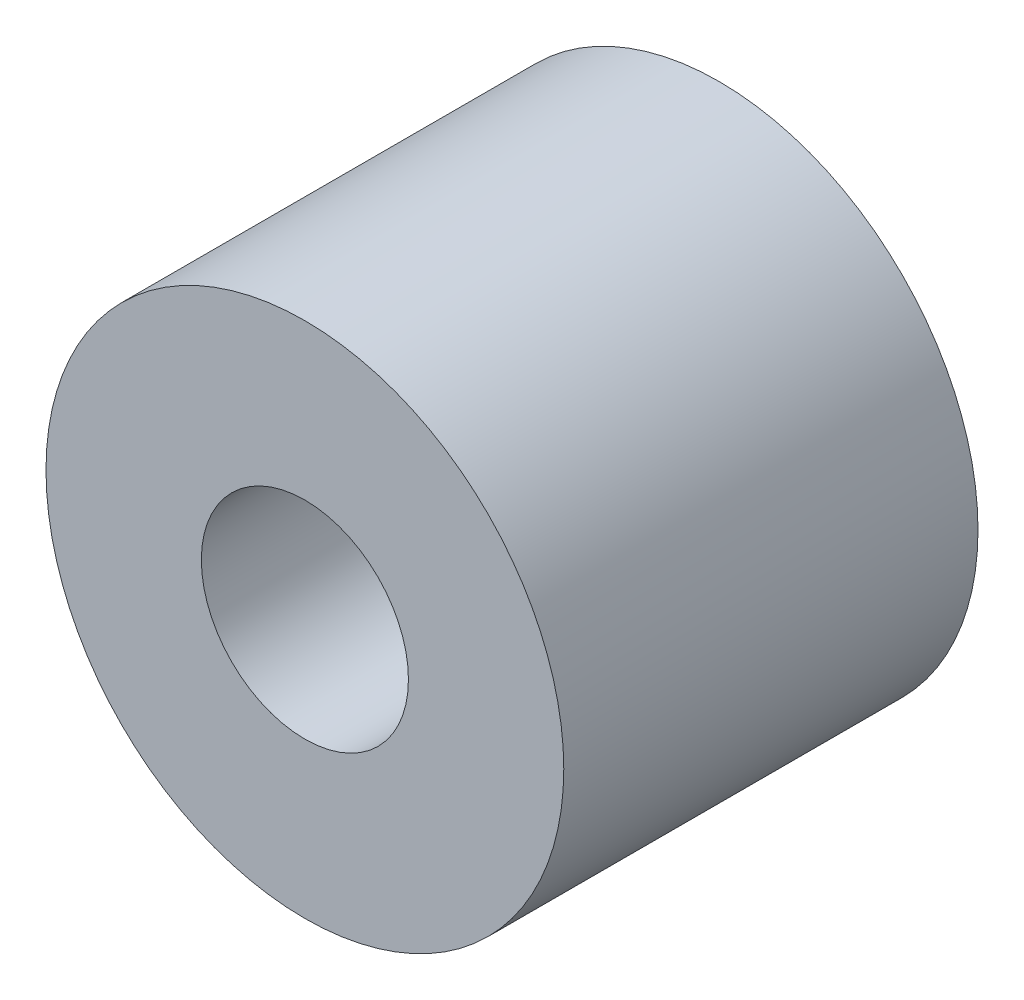
ISO-10303-21;
HEADER;
FILE_DESCRIPTION(('STEP AP214'),'2;1');
FILE_NAME('part.step','',(''),(''),'','','');
FILE_SCHEMA(('AUTOMOTIVE_DESIGN { 1 0 10303 214 1 1 1 1 }'));
ENDSEC;
DATA;
#1=APPLICATION_CONTEXT('core data for automotive mechanical design processes');
#2=APPLICATION_PROTOCOL_DEFINITION('international standard','automotive_design',2000,#1);
#3=PRODUCT_CONTEXT('',#1,'mechanical');
#4=PRODUCT('Part','Part','',(#3));
#5=PRODUCT_RELATED_PRODUCT_CATEGORY('part','',(#4));
#6=PRODUCT_DEFINITION_FORMATION('','',#4);
#7=PRODUCT_DEFINITION_CONTEXT('part definition',#1,'design');
#8=PRODUCT_DEFINITION('design','',#6,#7);
#9=PRODUCT_DEFINITION_SHAPE('','',#8);
#10=(LENGTH_UNIT() NAMED_UNIT(*) SI_UNIT(.MILLI.,.METRE.));
#11=(NAMED_UNIT(*) PLANE_ANGLE_UNIT() SI_UNIT($,.RADIAN.));
#12=(NAMED_UNIT(*) SI_UNIT($,.STERADIAN.) SOLID_ANGLE_UNIT());
#13=UNCERTAINTY_MEASURE_WITH_UNIT(LENGTH_MEASURE(1.E-05),#10,'distance_accuracy_value','');
#14=(GEOMETRIC_REPRESENTATION_CONTEXT(3) GLOBAL_UNCERTAINTY_ASSIGNED_CONTEXT((#13)) GLOBAL_UNIT_ASSIGNED_CONTEXT((#10,
#11,#12)) REPRESENTATION_CONTEXT('',''));
#15=CARTESIAN_POINT('',(0.,0.,0.));
#16=DIRECTION('',(0.,0.,1.));
#17=DIRECTION('',(1.,0.,0.));
#18=AXIS2_PLACEMENT_3D('',#15,#16,#17);
#19=CARTESIAN_POINT('',(0.,0.,40.));
#20=DIRECTION('',(0.,0.,1.));
#21=DIRECTION('',(1.,0.,0.));
#22=AXIS2_PLACEMENT_3D('',#19,#20,#21);
#23=PLANE('',#22);
#24=CARTESIAN_POINT('',(0.,0.,40.));
#25=DIRECTION('',(0.,0.,1.));
#26=DIRECTION('',(1.,0.,0.));
#27=AXIS2_PLACEMENT_3D('',#24,#25,#26);
#28=CIRCLE('',#27,25.);
#29=CARTESIAN_POINT('',(25.,0.,40.));
#30=VERTEX_POINT('',#29);
#31=EDGE_CURVE('E10',#30,#30,#28,.T.);
#32=ORIENTED_EDGE('',*,*,#31,.T.);
#33=EDGE_LOOP('',(#32));
#34=FACE_BOUND('',#33,.T.);
#35=CARTESIAN_POINT('',(0.,0.,40.));
#36=DIRECTION('',(0.,0.,1.));
#37=DIRECTION('',(1.,0.,0.));
#38=AXIS2_PLACEMENT_3D('',#35,#36,#37);
#39=CIRCLE('',#38,10.);
#40=CARTESIAN_POINT('',(10.,0.,40.));
#41=VERTEX_POINT('',#40);
#42=EDGE_CURVE('E42',#41,#41,#39,.T.);
#43=ORIENTED_EDGE('',*,*,#42,.F.);
#44=EDGE_LOOP('',(#43));
#45=FACE_BOUND('',#44,.T.);
#46=ADVANCED_FACE('F31',(#34,#45),#23,.T.);
#47=CARTESIAN_POINT('',(0.,0.,0.));
#48=DIRECTION('',(0.,0.,1.));
#49=DIRECTION('',(1.,0.,0.));
#50=AXIS2_PLACEMENT_3D('',#47,#48,#49);
#51=PLANE('',#50);
#52=CARTESIAN_POINT('',(0.,0.,0.));
#53=DIRECTION('',(0.,0.,1.));
#54=DIRECTION('',(1.,0.,0.));
#55=AXIS2_PLACEMENT_3D('',#52,#53,#54);
#56=CIRCLE('',#55,25.);
#57=CARTESIAN_POINT('',(25.,0.,0.));
#58=VERTEX_POINT('',#57);
#59=EDGE_CURVE('E35',#58,#58,#56,.T.);
#60=ORIENTED_EDGE('',*,*,#59,.F.);
#61=EDGE_LOOP('',(#60));
#62=FACE_BOUND('',#61,.T.);
#63=CARTESIAN_POINT('',(0.,0.,0.));
#64=DIRECTION('',(0.,0.,1.));
#65=DIRECTION('',(1.,0.,0.));
#66=AXIS2_PLACEMENT_3D('',#63,#64,#65);
#67=CIRCLE('',#66,10.);
#68=CARTESIAN_POINT('',(10.,0.,0.));
#69=VERTEX_POINT('',#68);
#70=EDGE_CURVE('E44',#69,#69,#67,.T.);
#71=ORIENTED_EDGE('',*,*,#70,.T.);
#72=EDGE_LOOP('',(#71));
#73=FACE_BOUND('',#72,.T.);
#74=ADVANCED_FACE('F54',(#62,#73),#51,.F.);
#75=CARTESIAN_POINT('',(0.,0.,40.));
#76=DIRECTION('',(0.,0.,-1.));
#77=DIRECTION('',(-1.,0.,0.));
#78=AXIS2_PLACEMENT_3D('',#75,#76,#77);
#79=CYLINDRICAL_SURFACE('',#78,25.);
#80=ORIENTED_EDGE('',*,*,#31,.F.);
#81=EDGE_LOOP('',(#80));
#82=FACE_BOUND('',#81,.T.);
#83=ORIENTED_EDGE('',*,*,#59,.T.);
#84=EDGE_LOOP('',(#83));
#85=FACE_BOUND('',#84,.T.);
#86=ADVANCED_FACE('F33',(#82,#85),#79,.T.);
#87=CARTESIAN_POINT('',(0.,0.,40.));
#88=DIRECTION('',(0.,0.,-1.));
#89=DIRECTION('',(-1.,0.,0.));
#90=AXIS2_PLACEMENT_3D('',#87,#88,#89);
#91=CYLINDRICAL_SURFACE('',#90,10.);
#92=ORIENTED_EDGE('',*,*,#42,.T.);
#93=EDGE_LOOP('',(#92));
#94=FACE_BOUND('',#93,.T.);
#95=ORIENTED_EDGE('',*,*,#70,.F.);
#96=EDGE_LOOP('',(#95));
#97=FACE_BOUND('',#96,.T.);
#98=ADVANCED_FACE('F50',(#94,#97),#91,.F.);
#99=CLOSED_SHELL('',(#46,#74,#86,#98));
#100=MANIFOLD_SOLID_BREP('B2',#99);
#101=ADVANCED_BREP_SHAPE_REPRESENTATION('',(#18,#100),#14);
#102=SHAPE_DEFINITION_REPRESENTATION(#9,#101);
ENDSEC;
END-ISO-10303-21;
